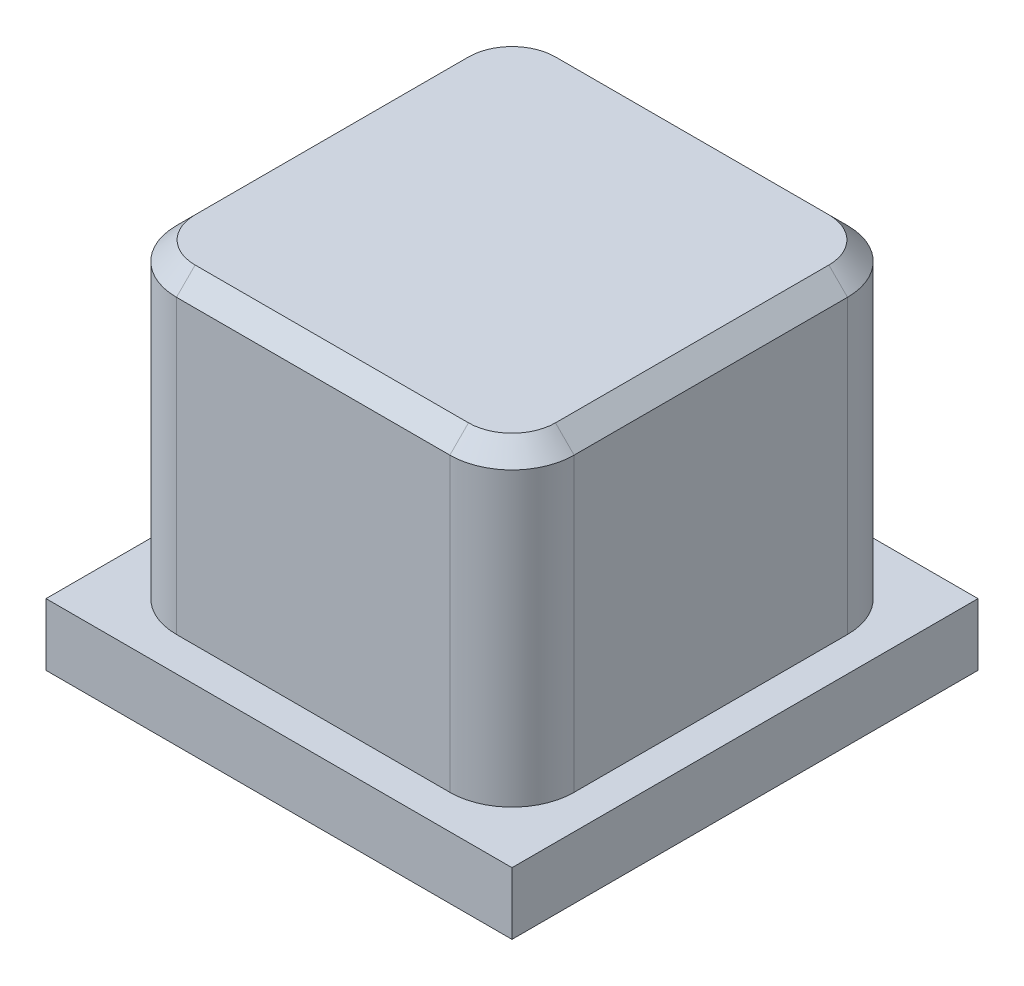
ISO-10303-21;
HEADER;
FILE_DESCRIPTION(('STEP AP214'),'2;1');
FILE_NAME('part.step','',(''),(''),'','','');
FILE_SCHEMA(('AUTOMOTIVE_DESIGN { 1 0 10303 214 1 1 1 1 }'));
ENDSEC;
DATA;
#1=APPLICATION_CONTEXT('core data for automotive mechanical design processes');
#2=APPLICATION_PROTOCOL_DEFINITION('international standard','automotive_design',2000,#1);
#3=PRODUCT_CONTEXT('',#1,'mechanical');
#4=PRODUCT('Part','Part','',(#3));
#5=PRODUCT_RELATED_PRODUCT_CATEGORY('part','',(#4));
#6=PRODUCT_DEFINITION_FORMATION('','',#4);
#7=PRODUCT_DEFINITION_CONTEXT('part definition',#1,'design');
#8=PRODUCT_DEFINITION('design','',#6,#7);
#9=PRODUCT_DEFINITION_SHAPE('','',#8);
#10=(LENGTH_UNIT() NAMED_UNIT(*) SI_UNIT(.MILLI.,.METRE.));
#11=(NAMED_UNIT(*) PLANE_ANGLE_UNIT() SI_UNIT($,.RADIAN.));
#12=(NAMED_UNIT(*) SI_UNIT($,.STERADIAN.) SOLID_ANGLE_UNIT());
#13=UNCERTAINTY_MEASURE_WITH_UNIT(LENGTH_MEASURE(1.E-05),#10,'distance_accuracy_value','');
#14=(GEOMETRIC_REPRESENTATION_CONTEXT(3) GLOBAL_UNCERTAINTY_ASSIGNED_CONTEXT((#13)) GLOBAL_UNIT_ASSIGNED_CONTEXT((#10,
#11,#12)) REPRESENTATION_CONTEXT('',''));
#15=CARTESIAN_POINT('',(0.,0.,0.));
#16=DIRECTION('',(0.,0.,1.));
#17=DIRECTION('',(1.,0.,0.));
#18=AXIS2_PLACEMENT_3D('',#15,#16,#17);
#19=CARTESIAN_POINT('',(0.,3.,0.));
#20=DIRECTION('',(0.,-1.,0.));
#21=DIRECTION('',(0.,0.,-1.));
#22=AXIS2_PLACEMENT_3D('',#19,#20,#21);
#23=PLANE('',#22);
#24=DIRECTION('',(0.,0.,-1.));
#25=VECTOR('',#24,1.);
#26=CARTESIAN_POINT('',(7.5,3.,7.5));
#27=LINE('',#26,#25);
#28=CARTESIAN_POINT('',(7.5,3.,7.5));
#29=VERTEX_POINT('',#28);
#30=CARTESIAN_POINT('',(7.5,3.,-7.5));
#31=VERTEX_POINT('',#30);
#32=EDGE_CURVE('E174',#29,#31,#27,.T.);
#33=ORIENTED_EDGE('',*,*,#32,.T.);
#34=DIRECTION('',(-1.,0.,0.));
#35=VECTOR('',#34,1.);
#36=CARTESIAN_POINT('',(-7.5,3.,-7.5));
#37=LINE('',#36,#35);
#38=CARTESIAN_POINT('',(-7.5,3.,-7.5));
#39=VERTEX_POINT('',#38);
#40=EDGE_CURVE('E162',#31,#39,#37,.T.);
#41=ORIENTED_EDGE('',*,*,#40,.T.);
#42=DIRECTION('',(0.,0.,1.));
#43=VECTOR('',#42,1.);
#44=CARTESIAN_POINT('',(-7.5,3.,7.5));
#45=LINE('',#44,#43);
#46=CARTESIAN_POINT('',(-7.5,3.,7.5));
#47=VERTEX_POINT('',#46);
#48=EDGE_CURVE('E173',#39,#47,#45,.T.);
#49=ORIENTED_EDGE('',*,*,#48,.T.);
#50=DIRECTION('',(1.,0.,0.));
#51=VECTOR('',#50,1.);
#52=CARTESIAN_POINT('',(-7.5,3.,7.5));
#53=LINE('',#52,#51);
#54=EDGE_CURVE('E179',#47,#29,#53,.T.);
#55=ORIENTED_EDGE('',*,*,#54,.T.);
#56=EDGE_LOOP('',(#33,#41,#49,#55));
#57=FACE_BOUND('',#56,.T.);
#58=DIRECTION('',(0.,0.,-1.));
#59=VECTOR('',#58,1.);
#60=CARTESIAN_POINT('',(6.4,3.,6.4));
#61=LINE('',#60,#59);
#62=CARTESIAN_POINT('',(6.4,3.,4.4));
#63=VERTEX_POINT('',#62);
#64=CARTESIAN_POINT('',(6.4,3.,-4.4));
#65=VERTEX_POINT('',#64);
#66=EDGE_CURVE('E220',#63,#65,#61,.T.);
#67=ORIENTED_EDGE('',*,*,#66,.F.);
#68=CARTESIAN_POINT('',(4.4,3.,4.4));
#69=DIRECTION('',(0.,-1.,0.));
#70=DIRECTION('',(0.,0.,-1.));
#71=AXIS2_PLACEMENT_3D('',#68,#69,#70);
#72=CIRCLE('',#71,2.);
#73=CARTESIAN_POINT('',(4.4,3.,6.4));
#74=VERTEX_POINT('',#73);
#75=EDGE_CURVE('E244',#63,#74,#72,.T.);
#76=ORIENTED_EDGE('',*,*,#75,.T.);
#77=DIRECTION('',(1.,0.,0.));
#78=VECTOR('',#77,1.);
#79=CARTESIAN_POINT('',(-6.4,3.,6.4));
#80=LINE('',#79,#78);
#81=CARTESIAN_POINT('',(-4.4,3.,6.4));
#82=VERTEX_POINT('',#81);
#83=EDGE_CURVE('E183',#82,#74,#80,.T.);
#84=ORIENTED_EDGE('',*,*,#83,.F.);
#85=CARTESIAN_POINT('',(-4.4,3.,4.4));
#86=DIRECTION('',(0.,-1.,0.));
#87=DIRECTION('',(0.,0.,-1.));
#88=AXIS2_PLACEMENT_3D('',#85,#86,#87);
#89=CIRCLE('',#88,2.);
#90=CARTESIAN_POINT('',(-6.4,3.,4.4));
#91=VERTEX_POINT('',#90);
#92=EDGE_CURVE('E242',#82,#91,#89,.T.);
#93=ORIENTED_EDGE('',*,*,#92,.T.);
#94=DIRECTION('',(0.,0.,1.));
#95=VECTOR('',#94,1.);
#96=CARTESIAN_POINT('',(-6.4,3.,6.4));
#97=LINE('',#96,#95);
#98=CARTESIAN_POINT('',(-6.4,3.,-4.4));
#99=VERTEX_POINT('',#98);
#100=EDGE_CURVE('E316',#99,#91,#97,.T.);
#101=ORIENTED_EDGE('',*,*,#100,.F.);
#102=CARTESIAN_POINT('',(-4.4,3.,-4.4));
#103=DIRECTION('',(0.,-1.,0.));
#104=DIRECTION('',(0.,0.,-1.));
#105=AXIS2_PLACEMENT_3D('',#102,#103,#104);
#106=CIRCLE('',#105,2.);
#107=CARTESIAN_POINT('',(-4.4,3.,-6.4));
#108=VERTEX_POINT('',#107);
#109=EDGE_CURVE('E240',#99,#108,#106,.T.);
#110=ORIENTED_EDGE('',*,*,#109,.T.);
#111=DIRECTION('',(-1.,0.,0.));
#112=VECTOR('',#111,1.);
#113=CARTESIAN_POINT('',(-6.4,3.,-6.4));
#114=LINE('',#113,#112);
#115=CARTESIAN_POINT('',(4.4,3.,-6.4));
#116=VERTEX_POINT('',#115);
#117=EDGE_CURVE('E314',#116,#108,#114,.T.);
#118=ORIENTED_EDGE('',*,*,#117,.F.);
#119=CARTESIAN_POINT('',(4.4,3.,-4.4));
#120=DIRECTION('',(0.,-1.,0.));
#121=DIRECTION('',(0.,0.,-1.));
#122=AXIS2_PLACEMENT_3D('',#119,#120,#121);
#123=CIRCLE('',#122,2.);
#124=EDGE_CURVE('E238',#116,#65,#123,.T.);
#125=ORIENTED_EDGE('',*,*,#124,.T.);
#126=EDGE_LOOP('',(#67,#76,#84,#93,#101,#110,#118,#125));
#127=FACE_BOUND('',#126,.T.);
#128=ADVANCED_FACE('F35',(#57,#127),#23,.F.);
#129=CARTESIAN_POINT('',(7.5,3.,7.5));
#130=DIRECTION('',(-1.,0.,0.));
#131=DIRECTION('',(0.,0.,1.));
#132=AXIS2_PLACEMENT_3D('',#129,#130,#131);
#133=PLANE('',#132);
#134=DIRECTION('',(0.,-1.,0.));
#135=VECTOR('',#134,1.);
#136=CARTESIAN_POINT('',(7.5,3.,7.5));
#137=LINE('',#136,#135);
#138=CARTESIAN_POINT('',(7.5,1.,7.5));
#139=VERTEX_POINT('',#138);
#140=EDGE_CURVE('E327',#29,#139,#137,.T.);
#141=ORIENTED_EDGE('',*,*,#140,.T.);
#142=DIRECTION('',(0.,0.,-1.));
#143=VECTOR('',#142,1.);
#144=CARTESIAN_POINT('',(7.5,1.,-7.5));
#145=LINE('',#144,#143);
#146=CARTESIAN_POINT('',(7.5,1.,-7.5));
#147=VERTEX_POINT('',#146);
#148=EDGE_CURVE('E187',#139,#147,#145,.T.);
#149=ORIENTED_EDGE('',*,*,#148,.T.);
#150=DIRECTION('',(0.,-1.,0.));
#151=VECTOR('',#150,1.);
#152=CARTESIAN_POINT('',(7.5,3.,-7.5));
#153=LINE('',#152,#151);
#154=EDGE_CURVE('E167',#31,#147,#153,.T.);
#155=ORIENTED_EDGE('',*,*,#154,.F.);
#156=ORIENTED_EDGE('',*,*,#32,.F.);
#157=EDGE_LOOP('',(#141,#149,#155,#156));
#158=FACE_BOUND('',#157,.T.);
#159=ADVANCED_FACE('F185',(#158),#133,.F.);
#160=CARTESIAN_POINT('',(-7.5,3.,-7.5));
#161=DIRECTION('',(0.,0.,1.));
#162=DIRECTION('',(1.,0.,0.));
#163=AXIS2_PLACEMENT_3D('',#160,#161,#162);
#164=PLANE('',#163);
#165=ORIENTED_EDGE('',*,*,#154,.T.);
#166=DIRECTION('',(-1.,0.,0.));
#167=VECTOR('',#166,1.);
#168=CARTESIAN_POINT('',(-7.5,1.,-7.5));
#169=LINE('',#168,#167);
#170=CARTESIAN_POINT('',(-7.5,1.,-7.5));
#171=VERTEX_POINT('',#170);
#172=EDGE_CURVE('E188',#147,#171,#169,.T.);
#173=ORIENTED_EDGE('',*,*,#172,.T.);
#174=DIRECTION('',(0.,-1.,0.));
#175=VECTOR('',#174,1.);
#176=CARTESIAN_POINT('',(-7.5,3.,-7.5));
#177=LINE('',#176,#175);
#178=EDGE_CURVE('E170',#39,#171,#177,.T.);
#179=ORIENTED_EDGE('',*,*,#178,.F.);
#180=ORIENTED_EDGE('',*,*,#40,.F.);
#181=EDGE_LOOP('',(#165,#173,#179,#180));
#182=FACE_BOUND('',#181,.T.);
#183=ADVANCED_FACE('F164',(#182),#164,.F.);
#184=CARTESIAN_POINT('',(-7.5,3.,7.5));
#185=DIRECTION('',(1.,0.,0.));
#186=DIRECTION('',(0.,0.,-1.));
#187=AXIS2_PLACEMENT_3D('',#184,#185,#186);
#188=PLANE('',#187);
#189=ORIENTED_EDGE('',*,*,#178,.T.);
#190=DIRECTION('',(0.,0.,1.));
#191=VECTOR('',#190,1.);
#192=CARTESIAN_POINT('',(-7.5,1.,7.5));
#193=LINE('',#192,#191);
#194=CARTESIAN_POINT('',(-7.5,1.,7.5));
#195=VERTEX_POINT('',#194);
#196=EDGE_CURVE('E204',#171,#195,#193,.T.);
#197=ORIENTED_EDGE('',*,*,#196,.T.);
#198=DIRECTION('',(0.,-1.,0.));
#199=VECTOR('',#198,1.);
#200=CARTESIAN_POINT('',(-7.5,3.,7.5));
#201=LINE('',#200,#199);
#202=EDGE_CURVE('E192',#47,#195,#201,.T.);
#203=ORIENTED_EDGE('',*,*,#202,.F.);
#204=ORIENTED_EDGE('',*,*,#48,.F.);
#205=EDGE_LOOP('',(#189,#197,#203,#204));
#206=FACE_BOUND('',#205,.T.);
#207=ADVANCED_FACE('F376',(#206),#188,.F.);
#208=CARTESIAN_POINT('',(-7.5,3.,7.5));
#209=DIRECTION('',(0.,0.,-1.));
#210=DIRECTION('',(-1.,0.,0.));
#211=AXIS2_PLACEMENT_3D('',#208,#209,#210);
#212=PLANE('',#211);
#213=ORIENTED_EDGE('',*,*,#202,.T.);
#214=DIRECTION('',(1.,0.,0.));
#215=VECTOR('',#214,1.);
#216=CARTESIAN_POINT('',(7.5,1.,7.5));
#217=LINE('',#216,#215);
#218=EDGE_CURVE('E206',#195,#139,#217,.T.);
#219=ORIENTED_EDGE('',*,*,#218,.T.);
#220=ORIENTED_EDGE('',*,*,#140,.F.);
#221=ORIENTED_EDGE('',*,*,#54,.F.);
#222=EDGE_LOOP('',(#213,#219,#220,#221));
#223=FACE_BOUND('',#222,.T.);
#224=ADVANCED_FACE('F332',(#223),#212,.F.);
#225=CARTESIAN_POINT('',(0.,0.,0.));
#226=DIRECTION('',(0.,-1.,0.));
#227=DIRECTION('',(0.,0.,-1.));
#228=AXIS2_PLACEMENT_3D('',#225,#226,#227);
#229=PLANE('',#228);
#230=DIRECTION('',(0.,0.,-1.));
#231=VECTOR('',#230,1.);
#232=CARTESIAN_POINT('',(-6.49999999999999,0.,-7.5));
#233=LINE('',#232,#231);
#234=CARTESIAN_POINT('',(-6.49999999999999,0.,6.49999999999999));
#235=VERTEX_POINT('',#234);
#236=CARTESIAN_POINT('',(-6.49999999999999,0.,-6.49999999999999));
#237=VERTEX_POINT('',#236);
#238=EDGE_CURVE('E199',#235,#237,#233,.T.);
#239=ORIENTED_EDGE('',*,*,#238,.T.);
#240=DIRECTION('',(1.,0.,0.));
#241=VECTOR('',#240,1.);
#242=CARTESIAN_POINT('',(7.5,0.,-6.49999999999999));
#243=LINE('',#242,#241);
#244=CARTESIAN_POINT('',(6.49999999999999,0.,-6.49999999999999));
#245=VERTEX_POINT('',#244);
#246=EDGE_CURVE('E201',#237,#245,#243,.T.);
#247=ORIENTED_EDGE('',*,*,#246,.T.);
#248=DIRECTION('',(0.,0.,1.));
#249=VECTOR('',#248,1.);
#250=CARTESIAN_POINT('',(6.49999999999999,0.,7.5));
#251=LINE('',#250,#249);
#252=CARTESIAN_POINT('',(6.49999999999999,0.,6.49999999999999));
#253=VERTEX_POINT('',#252);
#254=EDGE_CURVE('E190',#245,#253,#251,.T.);
#255=ORIENTED_EDGE('',*,*,#254,.T.);
#256=DIRECTION('',(-1.,0.,0.));
#257=VECTOR('',#256,1.);
#258=CARTESIAN_POINT('',(-7.5,0.,6.49999999999999));
#259=LINE('',#258,#257);
#260=EDGE_CURVE('E197',#253,#235,#259,.T.);
#261=ORIENTED_EDGE('',*,*,#260,.T.);
#262=EDGE_LOOP('',(#239,#247,#255,#261));
#263=FACE_BOUND('',#262,.T.);
#264=ADVANCED_FACE('F346',(#263),#229,.T.);
#265=CARTESIAN_POINT('',(6.4,13.,6.4));
#266=DIRECTION('',(-1.,0.,0.));
#267=DIRECTION('',(0.,0.,1.));
#268=AXIS2_PLACEMENT_3D('',#265,#266,#267);
#269=PLANE('',#268);
#270=DIRECTION('',(0.,-1.,0.));
#271=VECTOR('',#270,1.);
#272=CARTESIAN_POINT('',(6.4,13.,-4.4));
#273=LINE('',#272,#271);
#274=CARTESIAN_POINT('',(6.4,12.4,-4.4));
#275=VERTEX_POINT('',#274);
#276=EDGE_CURVE('E226',#65,#275,#273,.F.);
#277=ORIENTED_EDGE('',*,*,#276,.T.);
#278=DIRECTION('',(0.,0.,1.));
#279=VECTOR('',#278,1.);
#280=CARTESIAN_POINT('',(6.4,12.4,6.4));
#281=LINE('',#280,#279);
#282=CARTESIAN_POINT('',(6.4,12.4,4.4));
#283=VERTEX_POINT('',#282);
#284=EDGE_CURVE('E11',#275,#283,#281,.T.);
#285=ORIENTED_EDGE('',*,*,#284,.T.);
#286=DIRECTION('',(0.,-1.,0.));
#287=VECTOR('',#286,1.);
#288=CARTESIAN_POINT('',(6.4,13.,4.4));
#289=LINE('',#288,#287);
#290=EDGE_CURVE('E224',#283,#63,#289,.T.);
#291=ORIENTED_EDGE('',*,*,#290,.T.);
#292=ORIENTED_EDGE('',*,*,#66,.T.);
#293=EDGE_LOOP('',(#277,#285,#291,#292));
#294=FACE_BOUND('',#293,.T.);
#295=ADVANCED_FACE('F370',(#294),#269,.F.);
#296=CARTESIAN_POINT('',(-6.4,13.,-6.4));
#297=DIRECTION('',(0.,0.,1.));
#298=DIRECTION('',(1.,0.,0.));
#299=AXIS2_PLACEMENT_3D('',#296,#297,#298);
#300=PLANE('',#299);
#301=DIRECTION('',(0.,-1.,0.));
#302=VECTOR('',#301,1.);
#303=CARTESIAN_POINT('',(-4.4,13.,-6.4));
#304=LINE('',#303,#302);
#305=CARTESIAN_POINT('',(-4.4,12.4,-6.4));
#306=VERTEX_POINT('',#305);
#307=EDGE_CURVE('E209',#108,#306,#304,.F.);
#308=ORIENTED_EDGE('',*,*,#307,.T.);
#309=DIRECTION('',(1.,0.,0.));
#310=VECTOR('',#309,1.);
#311=CARTESIAN_POINT('',(-6.4,12.4,-6.4));
#312=LINE('',#311,#310);
#313=CARTESIAN_POINT('',(4.4,12.4,-6.4));
#314=VERTEX_POINT('',#313);
#315=EDGE_CURVE('E59',#306,#314,#312,.T.);
#316=ORIENTED_EDGE('',*,*,#315,.T.);
#317=DIRECTION('',(0.,-1.,0.));
#318=VECTOR('',#317,1.);
#319=CARTESIAN_POINT('',(4.4,13.,-6.4));
#320=LINE('',#319,#318);
#321=EDGE_CURVE('E222',#314,#116,#320,.T.);
#322=ORIENTED_EDGE('',*,*,#321,.T.);
#323=ORIENTED_EDGE('',*,*,#117,.T.);
#324=EDGE_LOOP('',(#308,#316,#322,#323));
#325=FACE_BOUND('',#324,.T.);
#326=ADVANCED_FACE('F312',(#325),#300,.F.);
#327=CARTESIAN_POINT('',(-6.4,13.,6.4));
#328=DIRECTION('',(1.,0.,0.));
#329=DIRECTION('',(0.,0.,-1.));
#330=AXIS2_PLACEMENT_3D('',#327,#328,#329);
#331=PLANE('',#330);
#332=DIRECTION('',(0.,-1.,0.));
#333=VECTOR('',#332,1.);
#334=CARTESIAN_POINT('',(-6.4,13.,4.4));
#335=LINE('',#334,#333);
#336=CARTESIAN_POINT('',(-6.4,12.4,4.4));
#337=VERTEX_POINT('',#336);
#338=EDGE_CURVE('E228',#91,#337,#335,.F.);
#339=ORIENTED_EDGE('',*,*,#338,.T.);
#340=DIRECTION('',(0.,0.,-1.));
#341=VECTOR('',#340,1.);
#342=CARTESIAN_POINT('',(-6.4,12.4,6.4));
#343=LINE('',#342,#341);
#344=CARTESIAN_POINT('',(-6.4,12.4,-4.4));
#345=VERTEX_POINT('',#344);
#346=EDGE_CURVE('E270',#337,#345,#343,.T.);
#347=ORIENTED_EDGE('',*,*,#346,.T.);
#348=DIRECTION('',(0.,-1.,0.));
#349=VECTOR('',#348,1.);
#350=CARTESIAN_POINT('',(-6.4,13.,-4.4));
#351=LINE('',#350,#349);
#352=EDGE_CURVE('E231',#345,#99,#351,.T.);
#353=ORIENTED_EDGE('',*,*,#352,.T.);
#354=ORIENTED_EDGE('',*,*,#100,.T.);
#355=EDGE_LOOP('',(#339,#347,#353,#354));
#356=FACE_BOUND('',#355,.T.);
#357=ADVANCED_FACE('F486',(#356),#331,.F.);
#358=CARTESIAN_POINT('',(-6.4,13.,6.4));
#359=DIRECTION('',(0.,0.,-1.));
#360=DIRECTION('',(-1.,0.,0.));
#361=AXIS2_PLACEMENT_3D('',#358,#359,#360);
#362=PLANE('',#361);
#363=DIRECTION('',(0.,-1.,0.));
#364=VECTOR('',#363,1.);
#365=CARTESIAN_POINT('',(4.4,13.,6.4));
#366=LINE('',#365,#364);
#367=CARTESIAN_POINT('',(4.4,12.4,6.4));
#368=VERTEX_POINT('',#367);
#369=EDGE_CURVE('E233',#74,#368,#366,.F.);
#370=ORIENTED_EDGE('',*,*,#369,.T.);
#371=DIRECTION('',(-1.,0.,0.));
#372=VECTOR('',#371,1.);
#373=CARTESIAN_POINT('',(-6.4,12.4,6.4));
#374=LINE('',#373,#372);
#375=CARTESIAN_POINT('',(-4.4,12.4,6.4));
#376=VERTEX_POINT('',#375);
#377=EDGE_CURVE('E266',#368,#376,#374,.T.);
#378=ORIENTED_EDGE('',*,*,#377,.T.);
#379=DIRECTION('',(0.,-1.,0.));
#380=VECTOR('',#379,1.);
#381=CARTESIAN_POINT('',(-4.4,13.,6.4));
#382=LINE('',#381,#380);
#383=EDGE_CURVE('E236',#376,#82,#382,.T.);
#384=ORIENTED_EDGE('',*,*,#383,.T.);
#385=ORIENTED_EDGE('',*,*,#83,.T.);
#386=EDGE_LOOP('',(#370,#378,#384,#385));
#387=FACE_BOUND('',#386,.T.);
#388=ADVANCED_FACE('F477',(#387),#362,.F.);
#389=CARTESIAN_POINT('',(0.,13.,0.));
#390=DIRECTION('',(0.,-1.,0.));
#391=DIRECTION('',(0.,0.,-1.));
#392=AXIS2_PLACEMENT_3D('',#389,#390,#391);
#393=PLANE('',#392);
#394=DIRECTION('',(1.,0.,0.));
#395=VECTOR('',#394,1.);
#396=CARTESIAN_POINT('',(0.,13.,5.8));
#397=LINE('',#396,#395);
#398=CARTESIAN_POINT('',(-4.4,13.,5.8));
#399=VERTEX_POINT('',#398);
#400=CARTESIAN_POINT('',(4.4,13.,5.8));
#401=VERTEX_POINT('',#400);
#402=EDGE_CURVE('E258',#399,#401,#397,.T.);
#403=ORIENTED_EDGE('',*,*,#402,.T.);
#404=CARTESIAN_POINT('',(4.4,13.,4.4));
#405=DIRECTION('',(0.,-1.,0.));
#406=DIRECTION('',(0.,0.,-1.));
#407=AXIS2_PLACEMENT_3D('',#404,#405,#406);
#408=CIRCLE('',#407,1.4);
#409=CARTESIAN_POINT('',(5.8,13.,4.4));
#410=VERTEX_POINT('',#409);
#411=EDGE_CURVE('E260',#401,#410,#408,.F.);
#412=ORIENTED_EDGE('',*,*,#411,.T.);
#413=DIRECTION('',(0.,0.,-1.));
#414=VECTOR('',#413,1.);
#415=CARTESIAN_POINT('',(5.8,13.,0.));
#416=LINE('',#415,#414);
#417=CARTESIAN_POINT('',(5.8,13.,-4.4));
#418=VERTEX_POINT('',#417);
#419=EDGE_CURVE('E246',#410,#418,#416,.T.);
#420=ORIENTED_EDGE('',*,*,#419,.T.);
#421=CARTESIAN_POINT('',(4.4,13.,-4.4));
#422=DIRECTION('',(0.,-1.,0.));
#423=DIRECTION('',(0.,0.,-1.));
#424=AXIS2_PLACEMENT_3D('',#421,#422,#423);
#425=CIRCLE('',#424,1.4);
#426=CARTESIAN_POINT('',(4.4,13.,-5.8));
#427=VERTEX_POINT('',#426);
#428=EDGE_CURVE('E248',#418,#427,#425,.F.);
#429=ORIENTED_EDGE('',*,*,#428,.T.);
#430=DIRECTION('',(-1.,0.,0.));
#431=VECTOR('',#430,1.);
#432=CARTESIAN_POINT('',(0.,13.,-5.8));
#433=LINE('',#432,#431);
#434=CARTESIAN_POINT('',(-4.4,13.,-5.8));
#435=VERTEX_POINT('',#434);
#436=EDGE_CURVE('E250',#427,#435,#433,.T.);
#437=ORIENTED_EDGE('',*,*,#436,.T.);
#438=CARTESIAN_POINT('',(-4.4,13.,-4.4));
#439=DIRECTION('',(0.,-1.,0.));
#440=DIRECTION('',(0.,0.,-1.));
#441=AXIS2_PLACEMENT_3D('',#438,#439,#440);
#442=CIRCLE('',#441,1.4);
#443=CARTESIAN_POINT('',(-5.8,13.,-4.4));
#444=VERTEX_POINT('',#443);
#445=EDGE_CURVE('E252',#435,#444,#442,.F.);
#446=ORIENTED_EDGE('',*,*,#445,.T.);
#447=DIRECTION('',(0.,0.,1.));
#448=VECTOR('',#447,1.);
#449=CARTESIAN_POINT('',(-5.8,13.,0.));
#450=LINE('',#449,#448);
#451=CARTESIAN_POINT('',(-5.8,13.,4.4));
#452=VERTEX_POINT('',#451);
#453=EDGE_CURVE('E254',#444,#452,#450,.T.);
#454=ORIENTED_EDGE('',*,*,#453,.T.);
#455=CARTESIAN_POINT('',(-4.4,13.,4.4));
#456=DIRECTION('',(0.,-1.,0.));
#457=DIRECTION('',(0.,0.,-1.));
#458=AXIS2_PLACEMENT_3D('',#455,#456,#457);
#459=CIRCLE('',#458,1.4);
#460=EDGE_CURVE('E256',#452,#399,#459,.F.);
#461=ORIENTED_EDGE('',*,*,#460,.T.);
#462=EDGE_LOOP('',(#403,#412,#420,#429,#437,#446,#454,#461));
#463=FACE_BOUND('',#462,.T.);
#464=ADVANCED_FACE('F360',(#463),#393,.F.);
#465=CARTESIAN_POINT('',(-7.5,1.,7.5));
#466=DIRECTION('',(0.,-0.707106781186549,0.707106781186546));
#467=DIRECTION('',(-1.,0.,0.));
#468=AXIS2_PLACEMENT_3D('',#465,#466,#467);
#469=PLANE('',#468);
#470=DIRECTION('',(0.577350269189626,-0.577350269189624,-0.577350269189626));
#471=VECTOR('',#470,1.);
#472=CARTESIAN_POINT('',(-7.5,1.,7.5));
#473=LINE('',#472,#471);
#474=EDGE_CURVE('E214',#235,#195,#473,.F.);
#475=ORIENTED_EDGE('',*,*,#474,.F.);
#476=ORIENTED_EDGE('',*,*,#260,.F.);
#477=DIRECTION('',(-0.577350269189626,-0.577350269189624,-0.577350269189626));
#478=VECTOR('',#477,1.);
#479=CARTESIAN_POINT('',(7.5,1.,7.5));
#480=LINE('',#479,#478);
#481=EDGE_CURVE('E217',#139,#253,#480,.T.);
#482=ORIENTED_EDGE('',*,*,#481,.F.);
#483=ORIENTED_EDGE('',*,*,#218,.F.);
#484=EDGE_LOOP('',(#475,#476,#482,#483));
#485=FACE_BOUND('',#484,.T.);
#486=ADVANCED_FACE('F337',(#485),#469,.T.);
#487=CARTESIAN_POINT('',(7.5,1.,7.5));
#488=DIRECTION('',(0.707106781186546,-0.707106781186549,0.));
#489=DIRECTION('',(0.,0.,1.));
#490=AXIS2_PLACEMENT_3D('',#487,#488,#489);
#491=PLANE('',#490);
#492=ORIENTED_EDGE('',*,*,#481,.T.);
#493=ORIENTED_EDGE('',*,*,#254,.F.);
#494=DIRECTION('',(0.577350269189626,0.577350269189624,-0.577350269189626));
#495=VECTOR('',#494,1.);
#496=CARTESIAN_POINT('',(2.49999999999999,-3.99999999999999,-2.49999999999999));
#497=LINE('',#496,#495);
#498=EDGE_CURVE('E212',#147,#245,#497,.F.);
#499=ORIENTED_EDGE('',*,*,#498,.F.);
#500=ORIENTED_EDGE('',*,*,#148,.F.);
#501=EDGE_LOOP('',(#492,#493,#499,#500));
#502=FACE_BOUND('',#501,.T.);
#503=ADVANCED_FACE('F352',(#502),#491,.T.);
#504=CARTESIAN_POINT('',(-7.5,1.,7.5));
#505=DIRECTION('',(-0.707106781186546,-0.707106781186549,0.));
#506=DIRECTION('',(0.,0.,-1.));
#507=AXIS2_PLACEMENT_3D('',#504,#505,#506);
#508=PLANE('',#507);
#509=ORIENTED_EDGE('',*,*,#474,.T.);
#510=ORIENTED_EDGE('',*,*,#196,.F.);
#511=DIRECTION('',(0.577350269189626,-0.577350269189624,0.577350269189626));
#512=VECTOR('',#511,1.);
#513=CARTESIAN_POINT('',(-2.49999999999999,-3.99999999999999,-2.49999999999999));
#514=LINE('',#513,#512);
#515=EDGE_CURVE('E210',#237,#171,#514,.F.);
#516=ORIENTED_EDGE('',*,*,#515,.F.);
#517=ORIENTED_EDGE('',*,*,#238,.F.);
#518=EDGE_LOOP('',(#509,#510,#516,#517));
#519=FACE_BOUND('',#518,.T.);
#520=ADVANCED_FACE('F342',(#519),#508,.T.);
#521=CARTESIAN_POINT('',(-7.5,1.,-7.5));
#522=DIRECTION('',(0.,-0.707106781186549,-0.707106781186546));
#523=DIRECTION('',(1.,0.,0.));
#524=AXIS2_PLACEMENT_3D('',#521,#522,#523);
#525=PLANE('',#524);
#526=ORIENTED_EDGE('',*,*,#498,.T.);
#527=ORIENTED_EDGE('',*,*,#246,.F.);
#528=ORIENTED_EDGE('',*,*,#515,.T.);
#529=ORIENTED_EDGE('',*,*,#172,.F.);
#530=EDGE_LOOP('',(#526,#527,#528,#529));
#531=FACE_BOUND('',#530,.T.);
#532=ADVANCED_FACE('F348',(#531),#525,.T.);
#533=CARTESIAN_POINT('',(4.4,13.,-4.4));
#534=DIRECTION('',(0.,-1.,0.));
#535=DIRECTION('',(0.,0.,-1.));
#536=AXIS2_PLACEMENT_3D('',#533,#534,#535);
#537=CYLINDRICAL_SURFACE('',#536,2.);
#538=ORIENTED_EDGE('',*,*,#321,.F.);
#539=CARTESIAN_POINT('',(4.4,12.4,-4.4));
#540=DIRECTION('',(0.,-1.,0.));
#541=DIRECTION('',(0.,0.,-1.));
#542=AXIS2_PLACEMENT_3D('',#539,#540,#541);
#543=CIRCLE('',#542,2.);
#544=EDGE_CURVE('E44',#314,#275,#543,.T.);
#545=ORIENTED_EDGE('',*,*,#544,.T.);
#546=ORIENTED_EDGE('',*,*,#276,.F.);
#547=ORIENTED_EDGE('',*,*,#124,.F.);
#548=EDGE_LOOP('',(#538,#545,#546,#547));
#549=FACE_BOUND('',#548,.T.);
#550=ADVANCED_FACE('F382',(#549),#537,.T.);
#551=CARTESIAN_POINT('',(-4.4,13.,-4.4));
#552=DIRECTION('',(0.,-1.,0.));
#553=DIRECTION('',(0.,0.,-1.));
#554=AXIS2_PLACEMENT_3D('',#551,#552,#553);
#555=CYLINDRICAL_SURFACE('',#554,2.);
#556=ORIENTED_EDGE('',*,*,#352,.F.);
#557=CARTESIAN_POINT('',(-4.4,12.4,-4.4));
#558=DIRECTION('',(0.,-1.,0.));
#559=DIRECTION('',(0.,0.,-1.));
#560=AXIS2_PLACEMENT_3D('',#557,#558,#559);
#561=CIRCLE('',#560,2.);
#562=EDGE_CURVE('E272',#345,#306,#561,.T.);
#563=ORIENTED_EDGE('',*,*,#562,.T.);
#564=ORIENTED_EDGE('',*,*,#307,.F.);
#565=ORIENTED_EDGE('',*,*,#109,.F.);
#566=EDGE_LOOP('',(#556,#563,#564,#565));
#567=FACE_BOUND('',#566,.T.);
#568=ADVANCED_FACE('F309',(#567),#555,.T.);
#569=CARTESIAN_POINT('',(-4.4,13.,4.4));
#570=DIRECTION('',(0.,-1.,0.));
#571=DIRECTION('',(0.,0.,-1.));
#572=AXIS2_PLACEMENT_3D('',#569,#570,#571);
#573=CYLINDRICAL_SURFACE('',#572,2.);
#574=ORIENTED_EDGE('',*,*,#383,.F.);
#575=CARTESIAN_POINT('',(-4.4,12.4,4.4));
#576=DIRECTION('',(0.,-1.,0.));
#577=DIRECTION('',(0.,0.,-1.));
#578=AXIS2_PLACEMENT_3D('',#575,#576,#577);
#579=CIRCLE('',#578,2.);
#580=EDGE_CURVE('E268',#376,#337,#579,.T.);
#581=ORIENTED_EDGE('',*,*,#580,.T.);
#582=ORIENTED_EDGE('',*,*,#338,.F.);
#583=ORIENTED_EDGE('',*,*,#92,.F.);
#584=EDGE_LOOP('',(#574,#581,#582,#583));
#585=FACE_BOUND('',#584,.T.);
#586=ADVANCED_FACE('F391',(#585),#573,.T.);
#587=CARTESIAN_POINT('',(4.4,13.,4.4));
#588=DIRECTION('',(0.,-1.,0.));
#589=DIRECTION('',(0.,0.,-1.));
#590=AXIS2_PLACEMENT_3D('',#587,#588,#589);
#591=CYLINDRICAL_SURFACE('',#590,2.);
#592=ORIENTED_EDGE('',*,*,#290,.F.);
#593=CARTESIAN_POINT('',(4.4,12.4,4.4));
#594=DIRECTION('',(0.,-1.,0.));
#595=DIRECTION('',(0.,0.,-1.));
#596=AXIS2_PLACEMENT_3D('',#593,#594,#595);
#597=CIRCLE('',#596,2.);
#598=EDGE_CURVE('E263',#283,#368,#597,.T.);
#599=ORIENTED_EDGE('',*,*,#598,.T.);
#600=ORIENTED_EDGE('',*,*,#369,.F.);
#601=ORIENTED_EDGE('',*,*,#75,.F.);
#602=EDGE_LOOP('',(#592,#599,#600,#601));
#603=FACE_BOUND('',#602,.T.);
#604=ADVANCED_FACE('F396',(#603),#591,.T.);
#605=CARTESIAN_POINT('',(-4.4,13.,-4.4));
#606=DIRECTION('',(0.,-1.,0.));
#607=DIRECTION('',(0.,0.,-1.));
#608=AXIS2_PLACEMENT_3D('',#605,#606,#607);
#609=CONICAL_SURFACE('',#608,1.4,0.785398163397448);
#610=DIRECTION('',(0.,0.707106781186547,0.707106781186547));
#611=VECTOR('',#610,1.);
#612=CARTESIAN_POINT('',(-4.4,12.4,-6.4));
#613=LINE('',#612,#611);
#614=EDGE_CURVE('E291',#306,#435,#613,.T.);
#615=ORIENTED_EDGE('',*,*,#614,.F.);
#616=ORIENTED_EDGE('',*,*,#562,.F.);
#617=DIRECTION('',(-0.707106781186547,-0.707106781186547,0.));
#618=VECTOR('',#617,1.);
#619=CARTESIAN_POINT('',(-5.8,13.,-4.4));
#620=LINE('',#619,#618);
#621=EDGE_CURVE('E39',#444,#345,#620,.T.);
#622=ORIENTED_EDGE('',*,*,#621,.F.);
#623=ORIENTED_EDGE('',*,*,#445,.F.);
#624=EDGE_LOOP('',(#615,#616,#622,#623));
#625=FACE_BOUND('',#624,.T.);
#626=ADVANCED_FACE('F37',(#625),#609,.T.);
#627=CARTESIAN_POINT('',(-5.8,13.,0.));
#628=DIRECTION('',(0.707106781186547,-0.707106781186547,0.));
#629=DIRECTION('',(0.,0.,1.));
#630=AXIS2_PLACEMENT_3D('',#627,#628,#629);
#631=PLANE('',#630);
#632=ORIENTED_EDGE('',*,*,#621,.T.);
#633=ORIENTED_EDGE('',*,*,#346,.F.);
#634=DIRECTION('',(-0.707106781186547,-0.707106781186547,0.));
#635=VECTOR('',#634,1.);
#636=CARTESIAN_POINT('',(-5.8,13.,4.4));
#637=LINE('',#636,#635);
#638=EDGE_CURVE('E289',#452,#337,#637,.T.);
#639=ORIENTED_EDGE('',*,*,#638,.F.);
#640=ORIENTED_EDGE('',*,*,#453,.F.);
#641=EDGE_LOOP('',(#632,#633,#639,#640));
#642=FACE_BOUND('',#641,.T.);
#643=ADVANCED_FACE('F301',(#642),#631,.F.);
#644=CARTESIAN_POINT('',(0.,13.,-5.8));
#645=DIRECTION('',(0.,-0.707106781186547,0.707106781186547));
#646=DIRECTION('',(-1.,0.,0.));
#647=AXIS2_PLACEMENT_3D('',#644,#645,#646);
#648=PLANE('',#647);
#649=ORIENTED_EDGE('',*,*,#614,.T.);
#650=ORIENTED_EDGE('',*,*,#436,.F.);
#651=DIRECTION('',(0.,0.707106781186547,0.707106781186547));
#652=VECTOR('',#651,1.);
#653=CARTESIAN_POINT('',(4.4,12.4,-6.4));
#654=LINE('',#653,#652);
#655=EDGE_CURVE('E286',#314,#427,#654,.T.);
#656=ORIENTED_EDGE('',*,*,#655,.F.);
#657=ORIENTED_EDGE('',*,*,#315,.F.);
#658=EDGE_LOOP('',(#649,#650,#656,#657));
#659=FACE_BOUND('',#658,.T.);
#660=ADVANCED_FACE('F420',(#659),#648,.F.);
#661=CARTESIAN_POINT('',(-4.4,13.,4.4));
#662=DIRECTION('',(0.,-1.,0.));
#663=DIRECTION('',(0.,0.,-1.));
#664=AXIS2_PLACEMENT_3D('',#661,#662,#663);
#665=CONICAL_SURFACE('',#664,1.4,0.785398163397448);
#666=ORIENTED_EDGE('',*,*,#638,.T.);
#667=ORIENTED_EDGE('',*,*,#580,.F.);
#668=DIRECTION('',(0.,-0.707106781186547,0.707106781186547));
#669=VECTOR('',#668,1.);
#670=CARTESIAN_POINT('',(-4.4,13.,5.8));
#671=LINE('',#670,#669);
#672=EDGE_CURVE('E283',#399,#376,#671,.T.);
#673=ORIENTED_EDGE('',*,*,#672,.F.);
#674=ORIENTED_EDGE('',*,*,#460,.F.);
#675=EDGE_LOOP('',(#666,#667,#673,#674));
#676=FACE_BOUND('',#675,.T.);
#677=ADVANCED_FACE('F416',(#676),#665,.T.);
#678=CARTESIAN_POINT('',(4.4,13.,-4.4));
#679=DIRECTION('',(0.,-1.,0.));
#680=DIRECTION('',(0.,0.,-1.));
#681=AXIS2_PLACEMENT_3D('',#678,#679,#680);
#682=CONICAL_SURFACE('',#681,1.4,0.785398163397448);
#683=ORIENTED_EDGE('',*,*,#655,.T.);
#684=ORIENTED_EDGE('',*,*,#428,.F.);
#685=DIRECTION('',(-0.707106781186547,0.707106781186547,0.));
#686=VECTOR('',#685,1.);
#687=CARTESIAN_POINT('',(6.4,12.4,-4.4));
#688=LINE('',#687,#686);
#689=EDGE_CURVE('E280',#275,#418,#688,.T.);
#690=ORIENTED_EDGE('',*,*,#689,.F.);
#691=ORIENTED_EDGE('',*,*,#544,.F.);
#692=EDGE_LOOP('',(#683,#684,#690,#691));
#693=FACE_BOUND('',#692,.T.);
#694=ADVANCED_FACE('F412',(#693),#682,.T.);
#695=CARTESIAN_POINT('',(0.,13.,5.8));
#696=DIRECTION('',(0.,-0.707106781186547,-0.707106781186547));
#697=DIRECTION('',(1.,0.,0.));
#698=AXIS2_PLACEMENT_3D('',#695,#696,#697);
#699=PLANE('',#698);
#700=ORIENTED_EDGE('',*,*,#672,.T.);
#701=ORIENTED_EDGE('',*,*,#377,.F.);
#702=DIRECTION('',(0.,-0.707106781186547,0.707106781186547));
#703=VECTOR('',#702,1.);
#704=CARTESIAN_POINT('',(4.4,13.,5.8));
#705=LINE('',#704,#703);
#706=EDGE_CURVE('E278',#401,#368,#705,.T.);
#707=ORIENTED_EDGE('',*,*,#706,.F.);
#708=ORIENTED_EDGE('',*,*,#402,.F.);
#709=EDGE_LOOP('',(#700,#701,#707,#708));
#710=FACE_BOUND('',#709,.T.);
#711=ADVANCED_FACE('F408',(#710),#699,.F.);
#712=CARTESIAN_POINT('',(5.8,13.,0.));
#713=DIRECTION('',(-0.707106781186547,-0.707106781186547,0.));
#714=DIRECTION('',(0.,0.,-1.));
#715=AXIS2_PLACEMENT_3D('',#712,#713,#714);
#716=PLANE('',#715);
#717=ORIENTED_EDGE('',*,*,#689,.T.);
#718=ORIENTED_EDGE('',*,*,#419,.F.);
#719=DIRECTION('',(-0.707106781186547,0.707106781186547,0.));
#720=VECTOR('',#719,1.);
#721=CARTESIAN_POINT('',(6.4,12.4,4.4));
#722=LINE('',#721,#720);
#723=EDGE_CURVE('E276',#283,#410,#722,.T.);
#724=ORIENTED_EDGE('',*,*,#723,.F.);
#725=ORIENTED_EDGE('',*,*,#284,.F.);
#726=EDGE_LOOP('',(#717,#718,#724,#725));
#727=FACE_BOUND('',#726,.T.);
#728=ADVANCED_FACE('F404',(#727),#716,.F.);
#729=CARTESIAN_POINT('',(4.4,13.,4.4));
#730=DIRECTION('',(0.,-1.,0.));
#731=DIRECTION('',(0.,0.,-1.));
#732=AXIS2_PLACEMENT_3D('',#729,#730,#731);
#733=CONICAL_SURFACE('',#732,1.4,0.785398163397448);
#734=ORIENTED_EDGE('',*,*,#706,.T.);
#735=ORIENTED_EDGE('',*,*,#598,.F.);
#736=ORIENTED_EDGE('',*,*,#723,.T.);
#737=ORIENTED_EDGE('',*,*,#411,.F.);
#738=EDGE_LOOP('',(#734,#735,#736,#737));
#739=FACE_BOUND('',#738,.T.);
#740=ADVANCED_FACE('F401',(#739),#733,.T.);
#741=CLOSED_SHELL('',(#128,#159,#183,#207,#224,#264,#295,#326,#357,#388,#464,#486,#503,#520,
#532,#550,#568,#586,#604,#626,#643,#660,#677,#694,#711,#728,#740));
#742=MANIFOLD_SOLID_BREP('B2',#741);
#743=ADVANCED_BREP_SHAPE_REPRESENTATION('',(#18,#742),#14);
#744=SHAPE_DEFINITION_REPRESENTATION(#9,#743);
ENDSEC;
END-ISO-10303-21;
